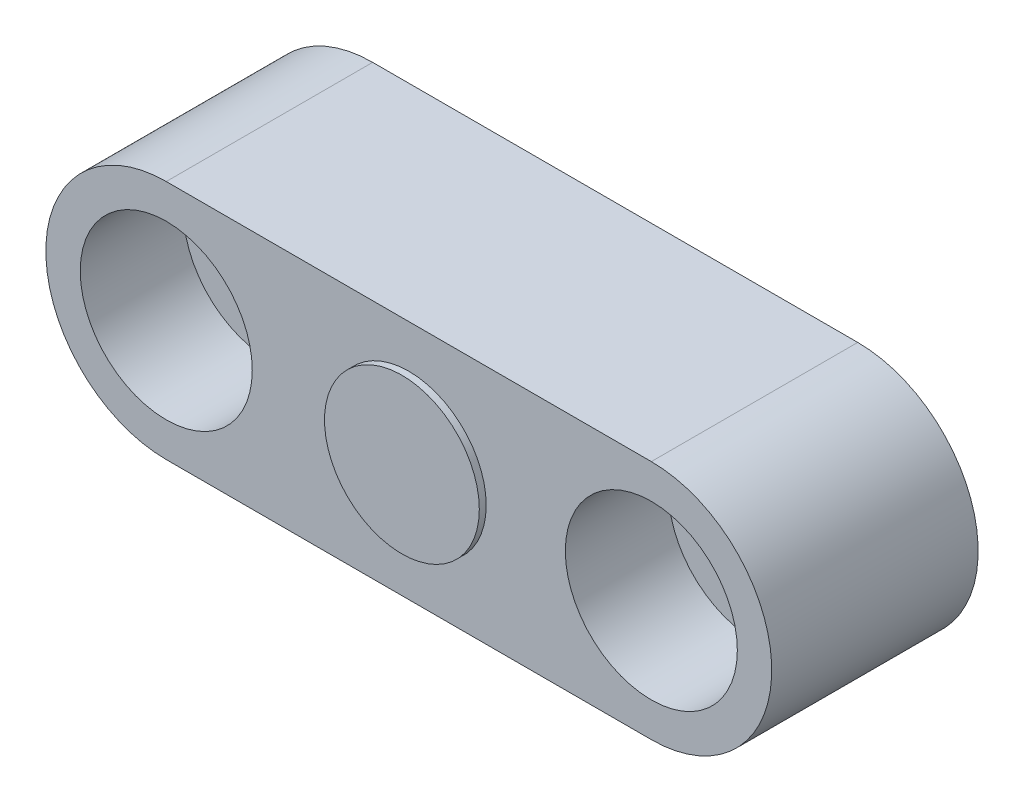
ISO-10303-21;
HEADER;
FILE_DESCRIPTION(('STEP AP214'),'2;1');
FILE_NAME('part.step','',(''),(''),'','','');
FILE_SCHEMA(('AUTOMOTIVE_DESIGN { 1 0 10303 214 1 1 1 1 }'));
ENDSEC;
DATA;
#1=APPLICATION_CONTEXT('core data for automotive mechanical design processes');
#2=APPLICATION_PROTOCOL_DEFINITION('international standard','automotive_design',2000,#1);
#3=PRODUCT_CONTEXT('',#1,'mechanical');
#4=PRODUCT('Part','Part','',(#3));
#5=PRODUCT_RELATED_PRODUCT_CATEGORY('part','',(#4));
#6=PRODUCT_DEFINITION_FORMATION('','',#4);
#7=PRODUCT_DEFINITION_CONTEXT('part definition',#1,'design');
#8=PRODUCT_DEFINITION('design','',#6,#7);
#9=PRODUCT_DEFINITION_SHAPE('','',#8);
#10=(LENGTH_UNIT() NAMED_UNIT(*) SI_UNIT(.MILLI.,.METRE.));
#11=(NAMED_UNIT(*) PLANE_ANGLE_UNIT() SI_UNIT($,.RADIAN.));
#12=(NAMED_UNIT(*) SI_UNIT($,.STERADIAN.) SOLID_ANGLE_UNIT());
#13=UNCERTAINTY_MEASURE_WITH_UNIT(LENGTH_MEASURE(1.E-05),#10,'distance_accuracy_value','');
#14=(GEOMETRIC_REPRESENTATION_CONTEXT(3) GLOBAL_UNCERTAINTY_ASSIGNED_CONTEXT((#13)) GLOBAL_UNIT_ASSIGNED_CONTEXT((#10,
#11,#12)) REPRESENTATION_CONTEXT('',''));
#15=CARTESIAN_POINT('',(0.,0.,0.));
#16=DIRECTION('',(0.,0.,1.));
#17=DIRECTION('',(1.,0.,0.));
#18=AXIS2_PLACEMENT_3D('',#15,#16,#17);
#19=CARTESIAN_POINT('',(7.05,0.,0.));
#20=DIRECTION('',(0.,0.,-1.));
#21=DIRECTION('',(-1.,0.,0.));
#22=AXIS2_PLACEMENT_3D('',#19,#20,#21);
#23=PLANE('',#22);
#24=CARTESIAN_POINT('',(-7.05,0.,0.));
#25=DIRECTION('',(0.,0.,1.));
#26=DIRECTION('',(-1.,0.,0.));
#27=AXIS2_PLACEMENT_3D('',#24,#25,#26);
#28=CIRCLE('',#27,3.17759916969509);
#29=CARTESIAN_POINT('',(-5.45794582904759,-2.75,0.));
#30=VERTEX_POINT('',#29);
#31=CARTESIAN_POINT('',(-5.45794582904759,2.75,0.));
#32=VERTEX_POINT('',#31);
#33=EDGE_CURVE('E52',#30,#32,#28,.T.);
#34=ORIENTED_EDGE('',*,*,#33,.F.);
#35=DIRECTION('',(-1.,0.,0.));
#36=VECTOR('',#35,1.);
#37=CARTESIAN_POINT('',(5.45794582904759,-2.75,0.));
#38=LINE('',#37,#36);
#39=CARTESIAN_POINT('',(5.45794582904759,-2.75,0.));
#40=VERTEX_POINT('',#39);
#41=EDGE_CURVE('E134',#40,#30,#38,.T.);
#42=ORIENTED_EDGE('',*,*,#41,.F.);
#43=CARTESIAN_POINT('',(7.05,0.,0.));
#44=DIRECTION('',(0.,0.,1.));
#45=DIRECTION('',(1.,0.,0.));
#46=AXIS2_PLACEMENT_3D('',#43,#44,#45);
#47=CIRCLE('',#46,3.17759916969509);
#48=CARTESIAN_POINT('',(5.45794582904759,2.75,0.));
#49=VERTEX_POINT('',#48);
#50=EDGE_CURVE('E118',#49,#40,#47,.T.);
#51=ORIENTED_EDGE('',*,*,#50,.F.);
#52=DIRECTION('',(1.,0.,0.));
#53=VECTOR('',#52,1.);
#54=CARTESIAN_POINT('',(5.45794582904759,2.75,0.));
#55=LINE('',#54,#53);
#56=EDGE_CURVE('E128',#32,#49,#55,.T.);
#57=ORIENTED_EDGE('',*,*,#56,.F.);
#58=EDGE_LOOP('',(#34,#42,#51,#57));
#59=FACE_BOUND('',#58,.T.);
#60=CARTESIAN_POINT('',(7.05,0.,0.));
#61=DIRECTION('',(0.,0.,1.));
#62=DIRECTION('',(-1.,0.,0.));
#63=AXIS2_PLACEMENT_3D('',#60,#61,#62);
#64=CIRCLE('',#63,3.49999999999994);
#65=CARTESIAN_POINT('',(7.05,-3.49999999999991,0.));
#66=VERTEX_POINT('',#65);
#67=CARTESIAN_POINT('',(7.05,3.49999999999998,0.));
#68=VERTEX_POINT('',#67);
#69=EDGE_CURVE('E180',#66,#68,#64,.T.);
#70=ORIENTED_EDGE('',*,*,#69,.F.);
#71=DIRECTION('',(1.,0.,0.));
#72=VECTOR('',#71,1.);
#73=CARTESIAN_POINT('',(7.05,-3.49999999999991,0.));
#74=LINE('',#73,#72);
#75=CARTESIAN_POINT('',(-7.05,-3.49999999999991,0.));
#76=VERTEX_POINT('',#75);
#77=EDGE_CURVE('E82',#76,#66,#74,.T.);
#78=ORIENTED_EDGE('',*,*,#77,.F.);
#79=CARTESIAN_POINT('',(-7.05,0.,0.));
#80=DIRECTION('',(0.,0.,1.));
#81=DIRECTION('',(1.,0.,0.));
#82=AXIS2_PLACEMENT_3D('',#79,#80,#81);
#83=CIRCLE('',#82,3.49999999999994);
#84=CARTESIAN_POINT('',(-7.05,3.49999999999994,0.));
#85=VERTEX_POINT('',#84);
#86=EDGE_CURVE('E194',#85,#76,#83,.T.);
#87=ORIENTED_EDGE('',*,*,#86,.F.);
#88=DIRECTION('',(-1.,0.,0.));
#89=VECTOR('',#88,1.);
#90=CARTESIAN_POINT('',(-7.05,3.49999999999998,0.));
#91=LINE('',#90,#89);
#92=EDGE_CURVE('E192',#68,#85,#91,.T.);
#93=ORIENTED_EDGE('',*,*,#92,.F.);
#94=EDGE_LOOP('',(#70,#78,#87,#93));
#95=FACE_BOUND('',#94,.T.);
#96=CARTESIAN_POINT('',(7.05,0.,0.));
#97=DIRECTION('',(0.,0.,-1.));
#98=DIRECTION('',(-1.,0.,0.));
#99=AXIS2_PLACEMENT_3D('',#96,#97,#98);
#100=CIRCLE('',#99,2.5);
#101=CARTESIAN_POINT('',(4.55,0.,0.));
#102=VERTEX_POINT('',#101);
#103=EDGE_CURVE('E167',#102,#102,#100,.T.);
#104=ORIENTED_EDGE('',*,*,#103,.F.);
#105=EDGE_LOOP('',(#104));
#106=FACE_BOUND('',#105,.T.);
#107=CARTESIAN_POINT('',(-7.05,0.,0.));
#108=DIRECTION('',(0.,0.,1.));
#109=DIRECTION('',(1.,0.,0.));
#110=AXIS2_PLACEMENT_3D('',#107,#108,#109);
#111=CIRCLE('',#110,2.5);
#112=CARTESIAN_POINT('',(-4.55,0.,0.));
#113=VERTEX_POINT('',#112);
#114=EDGE_CURVE('E149',#113,#113,#111,.T.);
#115=ORIENTED_EDGE('',*,*,#114,.T.);
#116=EDGE_LOOP('',(#115));
#117=FACE_BOUND('',#116,.T.);
#118=ADVANCED_FACE('F37',(#59,#95,#106,#117),#23,.T.);
#119=CARTESIAN_POINT('',(-7.05,0.,0.));
#120=DIRECTION('',(0.,0.,1.));
#121=DIRECTION('',(1.,0.,0.));
#122=AXIS2_PLACEMENT_3D('',#119,#120,#121);
#123=CYLINDRICAL_SURFACE('',#122,1.75);
#124=CARTESIAN_POINT('',(-7.05,0.,3.));
#125=DIRECTION('',(0.,0.,-1.));
#126=DIRECTION('',(-1.,0.,0.));
#127=AXIS2_PLACEMENT_3D('',#124,#125,#126);
#128=CIRCLE('',#127,1.75);
#129=CARTESIAN_POINT('',(-8.8,0.,3.));
#130=VERTEX_POINT('',#129);
#131=EDGE_CURVE('E153',#130,#130,#128,.T.);
#132=ORIENTED_EDGE('',*,*,#131,.F.);
#133=EDGE_LOOP('',(#132));
#134=FACE_BOUND('',#133,.T.);
#135=CARTESIAN_POINT('',(-7.05,0.,2.));
#136=DIRECTION('',(0.,0.,1.));
#137=DIRECTION('',(1.,0.,0.));
#138=AXIS2_PLACEMENT_3D('',#135,#136,#137);
#139=CIRCLE('',#138,1.75);
#140=CARTESIAN_POINT('',(-5.3,0.,2.));
#141=VERTEX_POINT('',#140);
#142=EDGE_CURVE('E145',#141,#141,#139,.T.);
#143=ORIENTED_EDGE('',*,*,#142,.F.);
#144=EDGE_LOOP('',(#143));
#145=FACE_BOUND('',#144,.T.);
#146=ADVANCED_FACE('F231',(#134,#145),#123,.F.);
#147=CARTESIAN_POINT('',(7.05,0.,0.));
#148=DIRECTION('',(0.,0.,1.));
#149=DIRECTION('',(1.,0.,0.));
#150=AXIS2_PLACEMENT_3D('',#147,#148,#149);
#151=CYLINDRICAL_SURFACE('',#150,1.75);
#152=CARTESIAN_POINT('',(7.05,0.,3.));
#153=DIRECTION('',(0.,0.,1.));
#154=DIRECTION('',(1.,0.,0.));
#155=AXIS2_PLACEMENT_3D('',#152,#153,#154);
#156=CIRCLE('',#155,1.75);
#157=CARTESIAN_POINT('',(8.8,0.,3.));
#158=VERTEX_POINT('',#157);
#159=EDGE_CURVE('E171',#158,#158,#156,.T.);
#160=ORIENTED_EDGE('',*,*,#159,.T.);
#161=EDGE_LOOP('',(#160));
#162=FACE_BOUND('',#161,.T.);
#163=CARTESIAN_POINT('',(7.05,0.,2.));
#164=DIRECTION('',(0.,0.,-1.));
#165=DIRECTION('',(-1.,0.,0.));
#166=AXIS2_PLACEMENT_3D('',#163,#164,#165);
#167=CIRCLE('',#166,1.75);
#168=CARTESIAN_POINT('',(5.3,0.,2.));
#169=VERTEX_POINT('',#168);
#170=EDGE_CURVE('E162',#169,#169,#167,.T.);
#171=ORIENTED_EDGE('',*,*,#170,.T.);
#172=EDGE_LOOP('',(#171));
#173=FACE_BOUND('',#172,.T.);
#174=ADVANCED_FACE('F235',(#162,#173),#151,.F.);
#175=CARTESIAN_POINT('',(7.05,0.,6.));
#176=DIRECTION('',(0.,0.,-1.));
#177=DIRECTION('',(-1.,0.,0.));
#178=AXIS2_PLACEMENT_3D('',#175,#176,#177);
#179=CYLINDRICAL_SURFACE('',#178,3.49999999999994);
#180=ORIENTED_EDGE('',*,*,#69,.T.);
#181=DIRECTION('',(0.,0.,-1.));
#182=VECTOR('',#181,1.);
#183=CARTESIAN_POINT('',(7.05,3.49999999999998,6.));
#184=LINE('',#183,#182);
#185=CARTESIAN_POINT('',(7.05,3.49999999999998,6.));
#186=VERTEX_POINT('',#185);
#187=EDGE_CURVE('E45',#186,#68,#184,.T.);
#188=ORIENTED_EDGE('',*,*,#187,.F.);
#189=CARTESIAN_POINT('',(7.05,0.,6.));
#190=DIRECTION('',(0.,0.,1.));
#191=DIRECTION('',(-1.,0.,0.));
#192=AXIS2_PLACEMENT_3D('',#189,#190,#191);
#193=CIRCLE('',#192,3.49999999999994);
#194=CARTESIAN_POINT('',(7.05,-3.49999999999991,6.));
#195=VERTEX_POINT('',#194);
#196=EDGE_CURVE('E183',#195,#186,#193,.T.);
#197=ORIENTED_EDGE('',*,*,#196,.F.);
#198=DIRECTION('',(0.,0.,-1.));
#199=VECTOR('',#198,1.);
#200=CARTESIAN_POINT('',(7.05,-3.49999999999991,6.));
#201=LINE('',#200,#199);
#202=EDGE_CURVE('E189',#195,#66,#201,.T.);
#203=ORIENTED_EDGE('',*,*,#202,.T.);
#204=EDGE_LOOP('',(#180,#188,#197,#203));
#205=FACE_BOUND('',#204,.T.);
#206=ADVANCED_FACE('F39',(#205),#179,.T.);
#207=CARTESIAN_POINT('',(-7.05,3.49999999999998,6.));
#208=DIRECTION('',(0.,-1.,0.));
#209=DIRECTION('',(0.,0.,-1.));
#210=AXIS2_PLACEMENT_3D('',#207,#208,#209);
#211=PLANE('',#210);
#212=ORIENTED_EDGE('',*,*,#92,.T.);
#213=DIRECTION('',(0.,0.,-1.));
#214=VECTOR('',#213,1.);
#215=CARTESIAN_POINT('',(-7.05,3.49999999999994,6.));
#216=LINE('',#215,#214);
#217=CARTESIAN_POINT('',(-7.05,3.49999999999994,6.));
#218=VERTEX_POINT('',#217);
#219=EDGE_CURVE('E200',#218,#85,#216,.T.);
#220=ORIENTED_EDGE('',*,*,#219,.F.);
#221=DIRECTION('',(-1.,0.,0.));
#222=VECTOR('',#221,1.);
#223=CARTESIAN_POINT('',(-7.05,3.49999999999998,6.));
#224=LINE('',#223,#222);
#225=EDGE_CURVE('E90',#186,#218,#224,.T.);
#226=ORIENTED_EDGE('',*,*,#225,.F.);
#227=ORIENTED_EDGE('',*,*,#187,.T.);
#228=EDGE_LOOP('',(#212,#220,#226,#227));
#229=FACE_BOUND('',#228,.T.);
#230=ADVANCED_FACE('F203',(#229),#211,.F.);
#231=CARTESIAN_POINT('',(-7.05,0.,6.));
#232=DIRECTION('',(0.,0.,-1.));
#233=DIRECTION('',(-1.,0.,0.));
#234=AXIS2_PLACEMENT_3D('',#231,#232,#233);
#235=CYLINDRICAL_SURFACE('',#234,3.49999999999994);
#236=ORIENTED_EDGE('',*,*,#86,.T.);
#237=DIRECTION('',(0.,0.,-1.));
#238=VECTOR('',#237,1.);
#239=CARTESIAN_POINT('',(-7.05,-3.49999999999991,6.));
#240=LINE('',#239,#238);
#241=CARTESIAN_POINT('',(-7.05,-3.49999999999991,6.));
#242=VERTEX_POINT('',#241);
#243=EDGE_CURVE('E198',#242,#76,#240,.T.);
#244=ORIENTED_EDGE('',*,*,#243,.F.);
#245=CARTESIAN_POINT('',(-7.05,0.,6.));
#246=DIRECTION('',(0.,0.,1.));
#247=DIRECTION('',(1.,0.,0.));
#248=AXIS2_PLACEMENT_3D('',#245,#246,#247);
#249=CIRCLE('',#248,3.49999999999994);
#250=EDGE_CURVE('E186',#218,#242,#249,.T.);
#251=ORIENTED_EDGE('',*,*,#250,.F.);
#252=ORIENTED_EDGE('',*,*,#219,.T.);
#253=EDGE_LOOP('',(#236,#244,#251,#252));
#254=FACE_BOUND('',#253,.T.);
#255=ADVANCED_FACE('F211',(#254),#235,.T.);
#256=CARTESIAN_POINT('',(7.05,-3.49999999999991,6.));
#257=DIRECTION('',(0.,1.,0.));
#258=DIRECTION('',(0.,0.,1.));
#259=AXIS2_PLACEMENT_3D('',#256,#257,#258);
#260=PLANE('',#259);
#261=ORIENTED_EDGE('',*,*,#77,.T.);
#262=ORIENTED_EDGE('',*,*,#202,.F.);
#263=DIRECTION('',(1.,0.,0.));
#264=VECTOR('',#263,1.);
#265=CARTESIAN_POINT('',(7.05,-3.49999999999991,6.));
#266=LINE('',#265,#264);
#267=EDGE_CURVE('E61',#242,#195,#266,.T.);
#268=ORIENTED_EDGE('',*,*,#267,.F.);
#269=ORIENTED_EDGE('',*,*,#243,.T.);
#270=EDGE_LOOP('',(#261,#262,#268,#269));
#271=FACE_BOUND('',#270,.T.);
#272=ADVANCED_FACE('F213',(#271),#260,.F.);
#273=CARTESIAN_POINT('',(7.05,0.,6.));
#274=DIRECTION('',(0.,0.,-1.));
#275=DIRECTION('',(-1.,0.,0.));
#276=AXIS2_PLACEMENT_3D('',#273,#274,#275);
#277=PLANE('',#276);
#278=CARTESIAN_POINT('',(0.,0.,6.));
#279=DIRECTION('',(0.,0.,-1.));
#280=DIRECTION('',(-1.,0.,0.));
#281=AXIS2_PLACEMENT_3D('',#278,#279,#280);
#282=CIRCLE('',#281,2.25);
#283=CARTESIAN_POINT('',(-2.25,0.,6.));
#284=VERTEX_POINT('',#283);
#285=EDGE_CURVE('E423',#284,#284,#282,.T.);
#286=ORIENTED_EDGE('',*,*,#285,.T.);
#287=EDGE_LOOP('',(#286));
#288=FACE_BOUND('',#287,.T.);
#289=CARTESIAN_POINT('',(-7.05,0.,6.));
#290=DIRECTION('',(0.,0.,-1.));
#291=DIRECTION('',(-1.,0.,0.));
#292=AXIS2_PLACEMENT_3D('',#289,#290,#291);
#293=CIRCLE('',#292,2.5);
#294=CARTESIAN_POINT('',(-9.55,0.,6.));
#295=VERTEX_POINT('',#294);
#296=EDGE_CURVE('E158',#295,#295,#293,.T.);
#297=ORIENTED_EDGE('',*,*,#296,.T.);
#298=EDGE_LOOP('',(#297));
#299=FACE_BOUND('',#298,.T.);
#300=CARTESIAN_POINT('',(7.05,0.,6.));
#301=DIRECTION('',(0.,0.,1.));
#302=DIRECTION('',(1.,0.,0.));
#303=AXIS2_PLACEMENT_3D('',#300,#301,#302);
#304=CIRCLE('',#303,2.5);
#305=CARTESIAN_POINT('',(9.55,0.,6.));
#306=VERTEX_POINT('',#305);
#307=EDGE_CURVE('E176',#306,#306,#304,.T.);
#308=ORIENTED_EDGE('',*,*,#307,.F.);
#309=EDGE_LOOP('',(#308));
#310=FACE_BOUND('',#309,.T.);
#311=ORIENTED_EDGE('',*,*,#196,.T.);
#312=ORIENTED_EDGE('',*,*,#225,.T.);
#313=ORIENTED_EDGE('',*,*,#250,.T.);
#314=ORIENTED_EDGE('',*,*,#267,.T.);
#315=EDGE_LOOP('',(#311,#312,#313,#314));
#316=FACE_BOUND('',#315,.T.);
#317=ADVANCED_FACE('F214',(#288,#299,#310,#316),#277,.F.);
#318=CARTESIAN_POINT('',(7.05,0.,3.));
#319=DIRECTION('',(0.,0.,1.));
#320=DIRECTION('',(1.,0.,0.));
#321=AXIS2_PLACEMENT_3D('',#318,#319,#320);
#322=CYLINDRICAL_SURFACE('',#321,2.5);
#323=CARTESIAN_POINT('',(7.05,0.,3.));
#324=DIRECTION('',(0.,0.,1.));
#325=DIRECTION('',(1.,0.,0.));
#326=AXIS2_PLACEMENT_3D('',#323,#324,#325);
#327=CIRCLE('',#326,2.5);
#328=CARTESIAN_POINT('',(9.55,0.,3.));
#329=VERTEX_POINT('',#328);
#330=EDGE_CURVE('E177',#329,#329,#327,.T.);
#331=ORIENTED_EDGE('',*,*,#330,.F.);
#332=EDGE_LOOP('',(#331));
#333=FACE_BOUND('',#332,.T.);
#334=ORIENTED_EDGE('',*,*,#307,.T.);
#335=EDGE_LOOP('',(#334));
#336=FACE_BOUND('',#335,.T.);
#337=ADVANCED_FACE('F216',(#333,#336),#322,.F.);
#338=CARTESIAN_POINT('',(7.05,0.,3.));
#339=DIRECTION('',(0.,0.,1.));
#340=DIRECTION('',(1.,0.,0.));
#341=AXIS2_PLACEMENT_3D('',#338,#339,#340);
#342=PLANE('',#341);
#343=ORIENTED_EDGE('',*,*,#159,.F.);
#344=EDGE_LOOP('',(#343));
#345=FACE_BOUND('',#344,.T.);
#346=ORIENTED_EDGE('',*,*,#330,.T.);
#347=EDGE_LOOP('',(#346));
#348=FACE_BOUND('',#347,.T.);
#349=ADVANCED_FACE('F223',(#345,#348),#342,.T.);
#350=CARTESIAN_POINT('',(7.05,0.,2.));
#351=DIRECTION('',(0.,0.,-1.));
#352=DIRECTION('',(-1.,0.,0.));
#353=AXIS2_PLACEMENT_3D('',#350,#351,#352);
#354=CYLINDRICAL_SURFACE('',#353,2.5);
#355=CARTESIAN_POINT('',(7.05,0.,2.));
#356=DIRECTION('',(0.,0.,-1.));
#357=DIRECTION('',(-1.,0.,0.));
#358=AXIS2_PLACEMENT_3D('',#355,#356,#357);
#359=CIRCLE('',#358,2.5);
#360=CARTESIAN_POINT('',(4.55,0.,2.));
#361=VERTEX_POINT('',#360);
#362=EDGE_CURVE('E168',#361,#361,#359,.T.);
#363=ORIENTED_EDGE('',*,*,#362,.F.);
#364=EDGE_LOOP('',(#363));
#365=FACE_BOUND('',#364,.T.);
#366=ORIENTED_EDGE('',*,*,#103,.T.);
#367=EDGE_LOOP('',(#366));
#368=FACE_BOUND('',#367,.T.);
#369=ADVANCED_FACE('F254',(#365,#368),#354,.F.);
#370=CARTESIAN_POINT('',(7.05,0.,2.));
#371=DIRECTION('',(0.,0.,-1.));
#372=DIRECTION('',(-1.,0.,0.));
#373=AXIS2_PLACEMENT_3D('',#370,#371,#372);
#374=PLANE('',#373);
#375=ORIENTED_EDGE('',*,*,#170,.F.);
#376=EDGE_LOOP('',(#375));
#377=FACE_BOUND('',#376,.T.);
#378=ORIENTED_EDGE('',*,*,#362,.T.);
#379=EDGE_LOOP('',(#378));
#380=FACE_BOUND('',#379,.T.);
#381=ADVANCED_FACE('F261',(#377,#380),#374,.T.);
#382=CARTESIAN_POINT('',(-7.05,0.,3.));
#383=DIRECTION('',(0.,0.,1.));
#384=DIRECTION('',(1.,0.,0.));
#385=AXIS2_PLACEMENT_3D('',#382,#383,#384);
#386=CYLINDRICAL_SURFACE('',#385,2.5);
#387=CARTESIAN_POINT('',(-7.05,0.,3.));
#388=DIRECTION('',(0.,0.,-1.));
#389=DIRECTION('',(-1.,0.,0.));
#390=AXIS2_PLACEMENT_3D('',#387,#388,#389);
#391=CIRCLE('',#390,2.5);
#392=CARTESIAN_POINT('',(-9.55,0.,3.));
#393=VERTEX_POINT('',#392);
#394=EDGE_CURVE('E159',#393,#393,#391,.T.);
#395=ORIENTED_EDGE('',*,*,#394,.T.);
#396=EDGE_LOOP('',(#395));
#397=FACE_BOUND('',#396,.T.);
#398=ORIENTED_EDGE('',*,*,#296,.F.);
#399=EDGE_LOOP('',(#398));
#400=FACE_BOUND('',#399,.T.);
#401=ADVANCED_FACE('F272',(#397,#400),#386,.F.);
#402=CARTESIAN_POINT('',(-7.05,0.,3.));
#403=DIRECTION('',(0.,0.,1.));
#404=DIRECTION('',(-1.,0.,0.));
#405=AXIS2_PLACEMENT_3D('',#402,#403,#404);
#406=PLANE('',#405);
#407=ORIENTED_EDGE('',*,*,#131,.T.);
#408=EDGE_LOOP('',(#407));
#409=FACE_BOUND('',#408,.T.);
#410=ORIENTED_EDGE('',*,*,#394,.F.);
#411=EDGE_LOOP('',(#410));
#412=FACE_BOUND('',#411,.T.);
#413=ADVANCED_FACE('F292',(#409,#412),#406,.T.);
#414=CARTESIAN_POINT('',(-7.05,0.,2.));
#415=DIRECTION('',(0.,0.,-1.));
#416=DIRECTION('',(1.,0.,0.));
#417=AXIS2_PLACEMENT_3D('',#414,#415,#416);
#418=PLANE('',#417);
#419=CARTESIAN_POINT('',(-7.05,0.,2.));
#420=DIRECTION('',(0.,0.,1.));
#421=DIRECTION('',(1.,0.,0.));
#422=AXIS2_PLACEMENT_3D('',#419,#420,#421);
#423=CIRCLE('',#422,2.5);
#424=CARTESIAN_POINT('',(-4.55,0.,2.));
#425=VERTEX_POINT('',#424);
#426=EDGE_CURVE('E150',#425,#425,#423,.T.);
#427=ORIENTED_EDGE('',*,*,#426,.F.);
#428=EDGE_LOOP('',(#427));
#429=FACE_BOUND('',#428,.T.);
#430=ORIENTED_EDGE('',*,*,#142,.T.);
#431=EDGE_LOOP('',(#430));
#432=FACE_BOUND('',#431,.T.);
#433=ADVANCED_FACE('F283',(#429,#432),#418,.T.);
#434=CARTESIAN_POINT('',(-7.05,0.,2.));
#435=DIRECTION('',(0.,0.,-1.));
#436=DIRECTION('',(-1.,0.,0.));
#437=AXIS2_PLACEMENT_3D('',#434,#435,#436);
#438=CYLINDRICAL_SURFACE('',#437,2.5);
#439=ORIENTED_EDGE('',*,*,#426,.T.);
#440=EDGE_LOOP('',(#439));
#441=FACE_BOUND('',#440,.T.);
#442=ORIENTED_EDGE('',*,*,#114,.F.);
#443=EDGE_LOOP('',(#442));
#444=FACE_BOUND('',#443,.T.);
#445=ADVANCED_FACE('F280',(#441,#444),#438,.F.);
#446=CARTESIAN_POINT('',(-7.05,0.,18.2232029636782));
#447=DIRECTION('',(0.,0.,-1.));
#448=DIRECTION('',(-1.,0.,0.));
#449=AXIS2_PLACEMENT_3D('',#446,#447,#448);
#450=CYLINDRICAL_SURFACE('',#449,3.17759916969509);
#451=CARTESIAN_POINT('',(-7.05,0.,5.));
#452=DIRECTION('',(0.,0.,-1.));
#453=DIRECTION('',(-1.,0.,0.));
#454=AXIS2_PLACEMENT_3D('',#451,#452,#453);
#455=CIRCLE('',#454,3.17759916969509);
#456=CARTESIAN_POINT('',(-5.45794582904759,2.75,5.));
#457=VERTEX_POINT('',#456);
#458=CARTESIAN_POINT('',(-5.45794582904759,-2.75,5.));
#459=VERTEX_POINT('',#458);
#460=EDGE_CURVE('E146',#457,#459,#455,.T.);
#461=ORIENTED_EDGE('',*,*,#460,.T.);
#462=DIRECTION('',(0.,0.,-1.));
#463=VECTOR('',#462,1.);
#464=CARTESIAN_POINT('',(-5.45794582904759,-2.75,18.2232029636782));
#465=LINE('',#464,#463);
#466=EDGE_CURVE('E139',#459,#30,#465,.T.);
#467=ORIENTED_EDGE('',*,*,#466,.T.);
#468=ORIENTED_EDGE('',*,*,#33,.T.);
#469=DIRECTION('',(0.,0.,-1.));
#470=VECTOR('',#469,1.);
#471=CARTESIAN_POINT('',(-5.45794582904759,2.75,18.2232029636782));
#472=LINE('',#471,#470);
#473=EDGE_CURVE('E125',#457,#32,#472,.T.);
#474=ORIENTED_EDGE('',*,*,#473,.F.);
#475=EDGE_LOOP('',(#461,#467,#468,#474));
#476=FACE_BOUND('',#475,.T.);
#477=ADVANCED_FACE('F282',(#476),#450,.T.);
#478=CARTESIAN_POINT('',(5.45794582904759,-2.75,18.2232029636782));
#479=DIRECTION('',(0.,-1.,0.));
#480=DIRECTION('',(1.,0.,0.));
#481=AXIS2_PLACEMENT_3D('',#478,#479,#480);
#482=PLANE('',#481);
#483=DIRECTION('',(1.,0.,0.));
#484=VECTOR('',#483,1.);
#485=CARTESIAN_POINT('',(5.45794582904759,-2.75,5.));
#486=LINE('',#485,#484);
#487=CARTESIAN_POINT('',(5.45794582904759,-2.75,5.));
#488=VERTEX_POINT('',#487);
#489=EDGE_CURVE('E428',#459,#488,#486,.T.);
#490=ORIENTED_EDGE('',*,*,#489,.T.);
#491=DIRECTION('',(0.,0.,-1.));
#492=VECTOR('',#491,1.);
#493=CARTESIAN_POINT('',(5.45794582904759,-2.75,18.2232029636782));
#494=LINE('',#493,#492);
#495=EDGE_CURVE('E124',#488,#40,#494,.T.);
#496=ORIENTED_EDGE('',*,*,#495,.T.);
#497=ORIENTED_EDGE('',*,*,#41,.T.);
#498=ORIENTED_EDGE('',*,*,#466,.F.);
#499=EDGE_LOOP('',(#490,#496,#497,#498));
#500=FACE_BOUND('',#499,.T.);
#501=ADVANCED_FACE('F290',(#500),#482,.F.);
#502=CARTESIAN_POINT('',(7.05,0.,18.2232029636782));
#503=DIRECTION('',(0.,0.,-1.));
#504=DIRECTION('',(-1.,0.,0.));
#505=AXIS2_PLACEMENT_3D('',#502,#503,#504);
#506=CYLINDRICAL_SURFACE('',#505,3.17759916969509);
#507=CARTESIAN_POINT('',(7.05,0.,5.));
#508=DIRECTION('',(0.,0.,-1.));
#509=DIRECTION('',(-1.,0.,0.));
#510=AXIS2_PLACEMENT_3D('',#507,#508,#509);
#511=CIRCLE('',#510,3.17759916969509);
#512=CARTESIAN_POINT('',(5.45794582904759,2.75,5.));
#513=VERTEX_POINT('',#512);
#514=EDGE_CURVE('E121',#488,#513,#511,.T.);
#515=ORIENTED_EDGE('',*,*,#514,.T.);
#516=DIRECTION('',(0.,0.,-1.));
#517=VECTOR('',#516,1.);
#518=CARTESIAN_POINT('',(5.45794582904759,2.75,18.2232029636782));
#519=LINE('',#518,#517);
#520=EDGE_CURVE('E113',#513,#49,#519,.T.);
#521=ORIENTED_EDGE('',*,*,#520,.T.);
#522=ORIENTED_EDGE('',*,*,#50,.T.);
#523=ORIENTED_EDGE('',*,*,#495,.F.);
#524=EDGE_LOOP('',(#515,#521,#522,#523));
#525=FACE_BOUND('',#524,.T.);
#526=ADVANCED_FACE('F115',(#525),#506,.T.);
#527=CARTESIAN_POINT('',(5.45794582904759,2.75,18.2232029636782));
#528=DIRECTION('',(0.,1.,0.));
#529=DIRECTION('',(-1.,0.,0.));
#530=AXIS2_PLACEMENT_3D('',#527,#528,#529);
#531=PLANE('',#530);
#532=DIRECTION('',(-1.,0.,0.));
#533=VECTOR('',#532,1.);
#534=CARTESIAN_POINT('',(5.45794582904759,2.75,5.));
#535=LINE('',#534,#533);
#536=EDGE_CURVE('E143',#513,#457,#535,.T.);
#537=ORIENTED_EDGE('',*,*,#536,.T.);
#538=ORIENTED_EDGE('',*,*,#473,.T.);
#539=ORIENTED_EDGE('',*,*,#56,.T.);
#540=ORIENTED_EDGE('',*,*,#520,.F.);
#541=EDGE_LOOP('',(#537,#538,#539,#540));
#542=FACE_BOUND('',#541,.T.);
#543=ADVANCED_FACE('F129',(#542),#531,.F.);
#544=CARTESIAN_POINT('',(7.05,0.,5.));
#545=DIRECTION('',(0.,0.,-1.));
#546=DIRECTION('',(-1.,0.,0.));
#547=AXIS2_PLACEMENT_3D('',#544,#545,#546);
#548=PLANE('',#547);
#549=CARTESIAN_POINT('',(0.,0.,5.));
#550=DIRECTION('',(0.,0.,-1.));
#551=DIRECTION('',(-1.,0.,0.));
#552=AXIS2_PLACEMENT_3D('',#549,#550,#551);
#553=CIRCLE('',#552,2.25);
#554=CARTESIAN_POINT('',(-2.25,0.,5.));
#555=VERTEX_POINT('',#554);
#556=EDGE_CURVE('E12',#555,#555,#553,.T.);
#557=ORIENTED_EDGE('',*,*,#556,.F.);
#558=EDGE_LOOP('',(#557));
#559=FACE_BOUND('',#558,.T.);
#560=ORIENTED_EDGE('',*,*,#460,.F.);
#561=ORIENTED_EDGE('',*,*,#536,.F.);
#562=ORIENTED_EDGE('',*,*,#514,.F.);
#563=ORIENTED_EDGE('',*,*,#489,.F.);
#564=EDGE_LOOP('',(#560,#561,#562,#563));
#565=FACE_BOUND('',#564,.T.);
#566=ADVANCED_FACE('F358',(#559,#565),#548,.T.);
#567=CARTESIAN_POINT('',(0.,0.,4.8));
#568=DIRECTION('',(0.,0.,1.));
#569=DIRECTION('',(1.,0.,0.));
#570=AXIS2_PLACEMENT_3D('',#567,#568,#569);
#571=PLANE('',#570);
#572=CARTESIAN_POINT('',(0.,0.,4.8));
#573=DIRECTION('',(0.,0.,1.));
#574=DIRECTION('',(1.,0.,0.));
#575=AXIS2_PLACEMENT_3D('',#572,#573,#574);
#576=CIRCLE('',#575,2.25);
#577=CARTESIAN_POINT('',(2.25,0.,4.8));
#578=VERTEX_POINT('',#577);
#579=EDGE_CURVE('E420',#578,#578,#576,.T.);
#580=ORIENTED_EDGE('',*,*,#579,.F.);
#581=EDGE_LOOP('',(#580));
#582=FACE_BOUND('',#581,.T.);
#583=ADVANCED_FACE('F374',(#582),#571,.F.);
#584=CARTESIAN_POINT('',(0.,0.,4.8));
#585=DIRECTION('',(0.,0.,1.));
#586=DIRECTION('',(1.,0.,0.));
#587=AXIS2_PLACEMENT_3D('',#584,#585,#586);
#588=CYLINDRICAL_SURFACE('',#587,2.25);
#589=ORIENTED_EDGE('',*,*,#556,.T.);
#590=EDGE_LOOP('',(#589));
#591=FACE_BOUND('',#590,.T.);
#592=ORIENTED_EDGE('',*,*,#579,.T.);
#593=EDGE_LOOP('',(#592));
#594=FACE_BOUND('',#593,.T.);
#595=ADVANCED_FACE('F384',(#591,#594),#588,.T.);
#596=CARTESIAN_POINT('',(0.,0.,6.2));
#597=DIRECTION('',(0.,0.,1.));
#598=DIRECTION('',(1.,0.,0.));
#599=AXIS2_PLACEMENT_3D('',#596,#597,#598);
#600=CIRCLE('',#599,2.25);
#601=CARTESIAN_POINT('',(2.25,0.,6.2));
#602=VERTEX_POINT('',#601);
#603=EDGE_CURVE('E419',#602,#602,#600,.T.);
#604=ORIENTED_EDGE('',*,*,#603,.F.);
#605=EDGE_LOOP('',(#604));
#606=FACE_BOUND('',#605,.T.);
#607=ORIENTED_EDGE('',*,*,#285,.F.);
#608=EDGE_LOOP('',(#607));
#609=FACE_BOUND('',#608,.T.);
#610=ADVANCED_FACE('F394',(#606,#609),#588,.T.);
#611=CARTESIAN_POINT('',(0.,0.,6.2));
#612=DIRECTION('',(0.,0.,1.));
#613=DIRECTION('',(1.,0.,0.));
#614=AXIS2_PLACEMENT_3D('',#611,#612,#613);
#615=PLANE('',#614);
#616=ORIENTED_EDGE('',*,*,#603,.T.);
#617=EDGE_LOOP('',(#616));
#618=FACE_BOUND('',#617,.T.);
#619=ADVANCED_FACE('F404',(#618),#615,.T.);
#620=CLOSED_SHELL('',(#118,#146,#174,#206,#230,#255,#272,#317,#337,#349,#369,#381,#401,#413,
#433,#445,#477,#501,#526,#543,#566,#583,#595,#610,#619));
#621=MANIFOLD_SOLID_BREP('B2',#620);
#622=ADVANCED_BREP_SHAPE_REPRESENTATION('',(#18,#621),#14);
#623=SHAPE_DEFINITION_REPRESENTATION(#9,#622);
ENDSEC;
END-ISO-10303-21;
